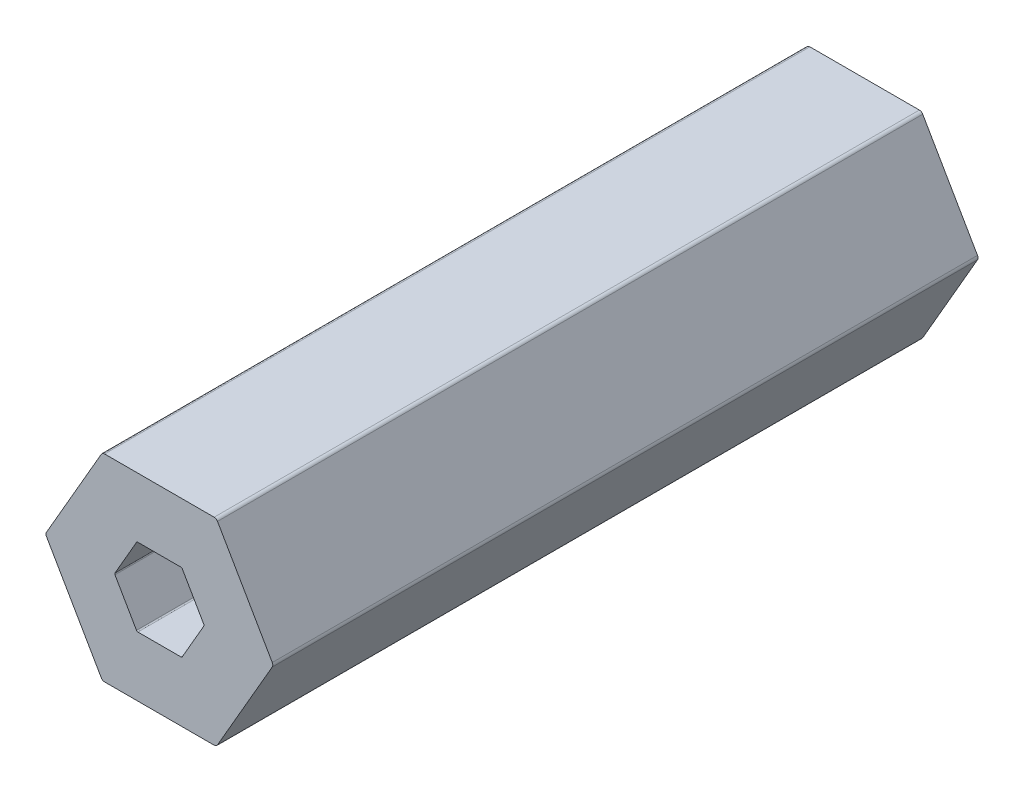
ISO-10303-21;
HEADER;
FILE_DESCRIPTION(('STEP AP214'),'2;1');
FILE_NAME('part.step','',(''),(''),'','','');
FILE_SCHEMA(('AUTOMOTIVE_DESIGN { 1 0 10303 214 1 1 1 1 }'));
ENDSEC;
DATA;
#1=APPLICATION_CONTEXT('core data for automotive mechanical design processes');
#2=APPLICATION_PROTOCOL_DEFINITION('international standard','automotive_design',2000,#1);
#3=PRODUCT_CONTEXT('',#1,'mechanical');
#4=PRODUCT('Part','Part','',(#3));
#5=PRODUCT_RELATED_PRODUCT_CATEGORY('part','',(#4));
#6=PRODUCT_DEFINITION_FORMATION('','',#4);
#7=PRODUCT_DEFINITION_CONTEXT('part definition',#1,'design');
#8=PRODUCT_DEFINITION('design','',#6,#7);
#9=PRODUCT_DEFINITION_SHAPE('','',#8);
#10=(LENGTH_UNIT() NAMED_UNIT(*) SI_UNIT(.MILLI.,.METRE.));
#11=(NAMED_UNIT(*) PLANE_ANGLE_UNIT() SI_UNIT($,.RADIAN.));
#12=(NAMED_UNIT(*) SI_UNIT($,.STERADIAN.) SOLID_ANGLE_UNIT());
#13=UNCERTAINTY_MEASURE_WITH_UNIT(LENGTH_MEASURE(1.E-05),#10,'distance_accuracy_value','');
#14=(GEOMETRIC_REPRESENTATION_CONTEXT(3) GLOBAL_UNCERTAINTY_ASSIGNED_CONTEXT((#13)) GLOBAL_UNIT_ASSIGNED_CONTEXT((#10,
#11,#12)) REPRESENTATION_CONTEXT('',''));
#15=CARTESIAN_POINT('',(0.,0.,0.));
#16=DIRECTION('',(0.,0.,1.));
#17=DIRECTION('',(1.,0.,0.));
#18=AXIS2_PLACEMENT_3D('',#15,#16,#17);
#19=CARTESIAN_POINT('',(2.77128129211021,0.,400.));
#20=DIRECTION('',(0.,0.,1.));
#21=DIRECTION('',(1.,0.,0.));
#22=AXIS2_PLACEMENT_3D('',#19,#20,#21);
#23=CYLINDRICAL_SURFACE('',#22,0.1);
#24=CARTESIAN_POINT('',(2.77128129211021,0.,12.192));
#25=DIRECTION('',(0.,0.,-1.));
#26=DIRECTION('',(-1.,0.,0.));
#27=AXIS2_PLACEMENT_3D('',#24,#25,#26);
#28=CIRCLE('',#27,0.1);
#29=CARTESIAN_POINT('',(2.8712812921102,0.,12.192));
#30=VERTEX_POINT('',#29);
#31=CARTESIAN_POINT('',(2.85788383248864,0.0500000000000084,12.192));
#32=VERTEX_POINT('',#31);
#33=EDGE_CURVE('E451',#30,#32,#28,.F.);
#34=ORIENTED_EDGE('',*,*,#33,.F.);
#35=DIRECTION('',(0.,0.,1.));
#36=VECTOR('',#35,1.);
#37=CARTESIAN_POINT('',(2.8712812921102,0.,400.));
#38=LINE('',#37,#36);
#39=CARTESIAN_POINT('',(2.8712812921102,0.,57.554));
#40=VERTEX_POINT('',#39);
#41=EDGE_CURVE('E267',#30,#40,#38,.T.);
#42=ORIENTED_EDGE('',*,*,#41,.T.);
#43=CARTESIAN_POINT('',(2.77128129211021,0.,57.554));
#44=DIRECTION('',(0.,0.,1.));
#45=DIRECTION('',(1.,0.,0.));
#46=AXIS2_PLACEMENT_3D('',#43,#44,#45);
#47=CIRCLE('',#46,0.1);
#48=CARTESIAN_POINT('',(2.85788383248864,0.0500000000000084,57.554));
#49=VERTEX_POINT('',#48);
#50=EDGE_CURVE('E430',#49,#40,#47,.F.);
#51=ORIENTED_EDGE('',*,*,#50,.F.);
#52=DIRECTION('',(0.,0.,1.));
#53=VECTOR('',#52,1.);
#54=CARTESIAN_POINT('',(2.85788383248865,0.0500000000000085,400.));
#55=LINE('',#54,#53);
#56=EDGE_CURVE('E295',#32,#49,#55,.T.);
#57=ORIENTED_EDGE('',*,*,#56,.F.);
#58=EDGE_LOOP('',(#34,#42,#51,#57));
#59=FACE_BOUND('',#58,.T.);
#60=ADVANCED_FACE('F68',(#59),#23,.F.);
#61=CARTESIAN_POINT('',(-7.04367328411341,0.,400.));
#62=DIRECTION('',(0.,0.,-1.));
#63=DIRECTION('',(-1.,0.,0.));
#64=AXIS2_PLACEMENT_3D('',#61,#62,#63);
#65=CYLINDRICAL_SURFACE('',#64,0.25);
#66=DIRECTION('',(0.,0.,-1.));
#67=VECTOR('',#66,1.);
#68=CARTESIAN_POINT('',(-7.29367328411341,0.,400.));
#69=LINE('',#68,#67);
#70=CARTESIAN_POINT('',(-7.29367328411341,0.,57.554));
#71=VERTEX_POINT('',#70);
#72=CARTESIAN_POINT('',(-7.29367328411341,0.,12.192));
#73=VERTEX_POINT('',#72);
#74=EDGE_CURVE('E269',#71,#73,#69,.T.);
#75=ORIENTED_EDGE('',*,*,#74,.T.);
#76=CARTESIAN_POINT('',(-7.04367328411341,0.,12.192));
#77=DIRECTION('',(0.,0.,-1.));
#78=DIRECTION('',(-1.,0.,0.));
#79=AXIS2_PLACEMENT_3D('',#76,#77,#78);
#80=CIRCLE('',#79,0.25);
#81=CARTESIAN_POINT('',(-7.26017963505952,-0.12500000000005,12.192));
#82=VERTEX_POINT('',#81);
#83=EDGE_CURVE('E407',#73,#82,#80,.F.);
#84=ORIENTED_EDGE('',*,*,#83,.T.);
#85=DIRECTION('',(0.,0.,-1.));
#86=VECTOR('',#85,1.);
#87=CARTESIAN_POINT('',(-7.26017963505952,-0.125000000000051,400.));
#88=LINE('',#87,#86);
#89=CARTESIAN_POINT('',(-7.26017963505952,-0.12500000000005,57.554));
#90=VERTEX_POINT('',#89);
#91=EDGE_CURVE('E282',#90,#82,#88,.T.);
#92=ORIENTED_EDGE('',*,*,#91,.F.);
#93=CARTESIAN_POINT('',(-7.04367328411341,0.,57.554));
#94=DIRECTION('',(0.,0.,1.));
#95=DIRECTION('',(1.,0.,0.));
#96=AXIS2_PLACEMENT_3D('',#93,#94,#95);
#97=CIRCLE('',#96,0.25);
#98=EDGE_CURVE('E389',#90,#71,#97,.F.);
#99=ORIENTED_EDGE('',*,*,#98,.T.);
#100=EDGE_LOOP('',(#75,#84,#92,#99));
#101=FACE_BOUND('',#100,.T.);
#102=ADVANCED_FACE('F405',(#101),#65,.T.);
#103=CARTESIAN_POINT('',(3.66617420935418,-6.34999999999993,400.));
#104=DIRECTION('',(-0.866025403784442,0.5,0.));
#105=DIRECTION('',(0.,0.,1.));
#106=AXIS2_PLACEMENT_3D('',#103,#104,#105);
#107=PLANE('',#106);
#108=DIRECTION('',(-0.499999999999999,-0.866025403784439,0.));
#109=VECTOR('',#108,1.);
#110=CARTESIAN_POINT('',(3.66617420935418,-6.34999999999993,12.192));
#111=LINE('',#110,#109);
#112=CARTESIAN_POINT('',(7.26017963505952,-0.125,12.192));
#113=VERTEX_POINT('',#112);
#114=CARTESIAN_POINT('',(3.73834299300289,-6.22499999999993,12.192));
#115=VERTEX_POINT('',#114);
#116=EDGE_CURVE('E471',#113,#115,#111,.T.);
#117=ORIENTED_EDGE('',*,*,#116,.F.);
#118=DIRECTION('',(0.,0.,1.));
#119=VECTOR('',#118,1.);
#120=CARTESIAN_POINT('',(7.26017963505952,-0.125,400.));
#121=LINE('',#120,#119);
#122=CARTESIAN_POINT('',(7.26017963505952,-0.125,57.554));
#123=VERTEX_POINT('',#122);
#124=EDGE_CURVE('E300',#113,#123,#121,.T.);
#125=ORIENTED_EDGE('',*,*,#124,.T.);
#126=DIRECTION('',(0.499999999999999,0.866025403784439,0.));
#127=VECTOR('',#126,1.);
#128=CARTESIAN_POINT('',(3.66617420935418,-6.34999999999993,57.554));
#129=LINE('',#128,#127);
#130=CARTESIAN_POINT('',(3.73834299300289,-6.22499999999993,57.554));
#131=VERTEX_POINT('',#130);
#132=EDGE_CURVE('E377',#131,#123,#129,.T.);
#133=ORIENTED_EDGE('',*,*,#132,.F.);
#134=DIRECTION('',(0.,0.,-1.));
#135=VECTOR('',#134,1.);
#136=CARTESIAN_POINT('',(3.73834299300288,-6.22499999999993,400.));
#137=LINE('',#136,#135);
#138=EDGE_CURVE('E297',#131,#115,#137,.T.);
#139=ORIENTED_EDGE('',*,*,#138,.T.);
#140=EDGE_LOOP('',(#117,#125,#133,#139));
#141=FACE_BOUND('',#140,.T.);
#142=ADVANCED_FACE('F483',(#141),#107,.F.);
#143=CARTESIAN_POINT('',(7.33234841870822,0.,400.));
#144=DIRECTION('',(-0.866025403784438,-0.5,0.));
#145=DIRECTION('',(-0.5,0.866025403784438,0.));
#146=AXIS2_PLACEMENT_3D('',#143,#144,#145);
#147=PLANE('',#146);
#148=DIRECTION('',(0.5,-0.866025403784438,0.));
#149=VECTOR('',#148,1.);
#150=CARTESIAN_POINT('',(7.33234841870822,0.,12.192));
#151=LINE('',#150,#149);
#152=CARTESIAN_POINT('',(3.7383429930028,6.225,12.192));
#153=VERTEX_POINT('',#152);
#154=CARTESIAN_POINT('',(7.26017963505952,0.125,12.192));
#155=VERTEX_POINT('',#154);
#156=EDGE_CURVE('E461',#153,#155,#151,.T.);
#157=ORIENTED_EDGE('',*,*,#156,.F.);
#158=DIRECTION('',(0.,0.,1.));
#159=VECTOR('',#158,1.);
#160=CARTESIAN_POINT('',(3.7383429930028,6.225,400.));
#161=LINE('',#160,#159);
#162=CARTESIAN_POINT('',(3.7383429930028,6.225,57.554));
#163=VERTEX_POINT('',#162);
#164=EDGE_CURVE('E288',#153,#163,#161,.T.);
#165=ORIENTED_EDGE('',*,*,#164,.T.);
#166=DIRECTION('',(-0.5,0.866025403784438,0.));
#167=VECTOR('',#166,1.);
#168=CARTESIAN_POINT('',(7.33234841870822,0.,57.554));
#169=LINE('',#168,#167);
#170=CARTESIAN_POINT('',(7.26017963505952,0.125,57.554));
#171=VERTEX_POINT('',#170);
#172=EDGE_CURVE('E365',#171,#163,#169,.T.);
#173=ORIENTED_EDGE('',*,*,#172,.F.);
#174=DIRECTION('',(0.,0.,-1.));
#175=VECTOR('',#174,1.);
#176=CARTESIAN_POINT('',(7.26017963505952,0.125,400.));
#177=LINE('',#176,#175);
#178=EDGE_CURVE('E290',#171,#155,#177,.T.);
#179=ORIENTED_EDGE('',*,*,#178,.T.);
#180=EDGE_LOOP('',(#157,#165,#173,#179));
#181=FACE_BOUND('',#180,.T.);
#182=ADVANCED_FACE('F491',(#181),#147,.F.);
#183=CARTESIAN_POINT('',(3.6661742093541,6.35,400.));
#184=DIRECTION('',(0.,-1.,0.));
#185=DIRECTION('',(0.,0.,-1.));
#186=AXIS2_PLACEMENT_3D('',#183,#184,#185);
#187=PLANE('',#186);
#188=DIRECTION('',(1.,0.,0.));
#189=VECTOR('',#188,1.);
#190=CARTESIAN_POINT('',(3.6661742093541,6.35,12.192));
#191=LINE('',#190,#189);
#192=CARTESIAN_POINT('',(-3.52183664205674,6.34999999999997,12.192));
#193=VERTEX_POINT('',#192);
#194=CARTESIAN_POINT('',(3.52183664205669,6.35,12.192));
#195=VERTEX_POINT('',#194);
#196=EDGE_CURVE('E83',#193,#195,#191,.T.);
#197=ORIENTED_EDGE('',*,*,#196,.F.);
#198=DIRECTION('',(0.,0.,1.));
#199=VECTOR('',#198,1.);
#200=CARTESIAN_POINT('',(-3.52183664205673,6.35,400.));
#201=LINE('',#200,#199);
#202=CARTESIAN_POINT('',(-3.52183664205674,6.34999999999997,57.554));
#203=VERTEX_POINT('',#202);
#204=EDGE_CURVE('E281',#193,#203,#201,.T.);
#205=ORIENTED_EDGE('',*,*,#204,.T.);
#206=DIRECTION('',(-1.,0.,0.));
#207=VECTOR('',#206,1.);
#208=CARTESIAN_POINT('',(3.6661742093541,6.35,57.554));
#209=LINE('',#208,#207);
#210=CARTESIAN_POINT('',(3.52183664205669,6.35,57.554));
#211=VERTEX_POINT('',#210);
#212=EDGE_CURVE('E359',#211,#203,#209,.T.);
#213=ORIENTED_EDGE('',*,*,#212,.F.);
#214=DIRECTION('',(0.,0.,-1.));
#215=VECTOR('',#214,1.);
#216=CARTESIAN_POINT('',(3.52183664205669,6.35,400.));
#217=LINE('',#216,#215);
#218=EDGE_CURVE('E271',#211,#195,#217,.T.);
#219=ORIENTED_EDGE('',*,*,#218,.T.);
#220=EDGE_LOOP('',(#197,#205,#213,#219));
#221=FACE_BOUND('',#220,.T.);
#222=ADVANCED_FACE('F498',(#221),#187,.F.);
#223=CARTESIAN_POINT('',(-3.66617420935414,6.35,400.));
#224=DIRECTION('',(0.866025403784442,-0.5,0.));
#225=DIRECTION('',(0.,0.,-1.));
#226=AXIS2_PLACEMENT_3D('',#223,#224,#225);
#227=PLANE('',#226);
#228=DIRECTION('',(0.499999999999999,0.866025403784439,0.));
#229=VECTOR('',#228,1.);
#230=CARTESIAN_POINT('',(-3.66617420935414,6.35,12.192));
#231=LINE('',#230,#229);
#232=CARTESIAN_POINT('',(-7.26017963505957,0.124999999999951,12.192));
#233=VERTEX_POINT('',#232);
#234=CARTESIAN_POINT('',(-3.73834299300284,6.225,12.192));
#235=VERTEX_POINT('',#234);
#236=EDGE_CURVE('E469',#233,#235,#231,.T.);
#237=ORIENTED_EDGE('',*,*,#236,.F.);
#238=DIRECTION('',(0.,0.,1.));
#239=VECTOR('',#238,1.);
#240=CARTESIAN_POINT('',(-7.26017963505952,0.124999999999949,400.));
#241=LINE('',#240,#239);
#242=CARTESIAN_POINT('',(-7.26017963505957,0.124999999999951,57.554));
#243=VERTEX_POINT('',#242);
#244=EDGE_CURVE('E270',#233,#243,#241,.T.);
#245=ORIENTED_EDGE('',*,*,#244,.T.);
#246=DIRECTION('',(-0.499999999999999,-0.866025403784439,0.));
#247=VECTOR('',#246,1.);
#248=CARTESIAN_POINT('',(-3.66617420935414,6.35,57.554));
#249=LINE('',#248,#247);
#250=CARTESIAN_POINT('',(-3.73834299300284,6.225,57.554));
#251=VERTEX_POINT('',#250);
#252=EDGE_CURVE('E374',#251,#243,#249,.T.);
#253=ORIENTED_EDGE('',*,*,#252,.F.);
#254=DIRECTION('',(0.,0.,-1.));
#255=VECTOR('',#254,1.);
#256=CARTESIAN_POINT('',(-3.73834299300284,6.225,400.));
#257=LINE('',#256,#255);
#258=EDGE_CURVE('E272',#251,#235,#257,.T.);
#259=ORIENTED_EDGE('',*,*,#258,.T.);
#260=EDGE_LOOP('',(#237,#245,#253,#259));
#261=FACE_BOUND('',#260,.T.);
#262=ADVANCED_FACE('F505',(#261),#227,.F.);
#263=CARTESIAN_POINT('',(-7.33234841870822,0.,400.));
#264=DIRECTION('',(0.866025403784435,0.500000000000007,0.));
#265=DIRECTION('',(0.,0.,-1.));
#266=AXIS2_PLACEMENT_3D('',#263,#264,#265);
#267=PLANE('',#266);
#268=DIRECTION('',(-0.500000000000007,0.866025403784435,0.));
#269=VECTOR('',#268,1.);
#270=CARTESIAN_POINT('',(-7.33234841870822,0.,12.192));
#271=LINE('',#270,#269);
#272=CARTESIAN_POINT('',(-3.73834299300275,-6.225,12.192));
#273=VERTEX_POINT('',#272);
#274=EDGE_CURVE('E413',#273,#82,#271,.T.);
#275=ORIENTED_EDGE('',*,*,#274,.F.);
#276=DIRECTION('',(0.,0.,1.));
#277=VECTOR('',#276,1.);
#278=CARTESIAN_POINT('',(-3.73834299300275,-6.225,400.));
#279=LINE('',#278,#277);
#280=CARTESIAN_POINT('',(-3.73834299300275,-6.225,57.554));
#281=VERTEX_POINT('',#280);
#282=EDGE_CURVE('E265',#273,#281,#279,.T.);
#283=ORIENTED_EDGE('',*,*,#282,.T.);
#284=DIRECTION('',(0.500000000000007,-0.866025403784435,0.));
#285=VECTOR('',#284,1.);
#286=CARTESIAN_POINT('',(-7.33234841870822,0.,57.554));
#287=LINE('',#286,#285);
#288=EDGE_CURVE('E317',#90,#281,#287,.T.);
#289=ORIENTED_EDGE('',*,*,#288,.F.);
#290=ORIENTED_EDGE('',*,*,#91,.T.);
#291=EDGE_LOOP('',(#275,#283,#289,#290));
#292=FACE_BOUND('',#291,.T.);
#293=ADVANCED_FACE('F402',(#292),#267,.F.);
#294=CARTESIAN_POINT('',(-3.66617420935405,-6.35,400.));
#295=DIRECTION('',(0.,1.,0.));
#296=DIRECTION('',(1.,0.,0.));
#297=AXIS2_PLACEMENT_3D('',#294,#295,#296);
#298=PLANE('',#297);
#299=DIRECTION('',(-1.,0.,0.));
#300=VECTOR('',#299,1.);
#301=CARTESIAN_POINT('',(-3.66617420935405,-6.35,12.192));
#302=LINE('',#301,#300);
#303=CARTESIAN_POINT('',(3.52183664205678,-6.35,12.192));
#304=VERTEX_POINT('',#303);
#305=CARTESIAN_POINT('',(-3.52183664205664,-6.35,12.192));
#306=VERTEX_POINT('',#305);
#307=EDGE_CURVE('E410',#304,#306,#302,.T.);
#308=ORIENTED_EDGE('',*,*,#307,.F.);
#309=DIRECTION('',(0.,0.,1.));
#310=VECTOR('',#309,1.);
#311=CARTESIAN_POINT('',(3.52183664205678,-6.35,400.));
#312=LINE('',#311,#310);
#313=CARTESIAN_POINT('',(3.52183664205678,-6.35,57.554));
#314=VERTEX_POINT('',#313);
#315=EDGE_CURVE('E285',#304,#314,#312,.T.);
#316=ORIENTED_EDGE('',*,*,#315,.T.);
#317=DIRECTION('',(1.,0.,0.));
#318=VECTOR('',#317,1.);
#319=CARTESIAN_POINT('',(-3.66617420935405,-6.35,57.554));
#320=LINE('',#319,#318);
#321=CARTESIAN_POINT('',(-3.52183664205664,-6.35,57.554));
#322=VERTEX_POINT('',#321);
#323=EDGE_CURVE('E386',#322,#314,#320,.T.);
#324=ORIENTED_EDGE('',*,*,#323,.F.);
#325=DIRECTION('',(0.,0.,-1.));
#326=VECTOR('',#325,1.);
#327=CARTESIAN_POINT('',(-3.52183664205664,-6.35,400.));
#328=LINE('',#327,#326);
#329=EDGE_CURVE('E287',#322,#306,#328,.T.);
#330=ORIENTED_EDGE('',*,*,#329,.T.);
#331=EDGE_LOOP('',(#308,#316,#324,#330));
#332=FACE_BOUND('',#331,.T.);
#333=ADVANCED_FACE('F529',(#332),#298,.F.);
#334=CARTESIAN_POINT('',(1.66837567297407,2.110288568297,400.));
#335=DIRECTION('',(-0.866025403784437,-0.5,0.));
#336=DIRECTION('',(-0.5,0.866025403784437,0.));
#337=AXIS2_PLACEMENT_3D('',#334,#335,#336);
#338=PLANE('',#337);
#339=DIRECTION('',(0.,0.,-1.));
#340=VECTOR('',#339,1.);
#341=CARTESIAN_POINT('',(1.47224318643354,2.45,0.));
#342=LINE('',#341,#340);
#343=CARTESIAN_POINT('',(1.47224318643354,2.45,57.554));
#344=VERTEX_POINT('',#343);
#345=CARTESIAN_POINT('',(1.47224318643354,2.45,12.192));
#346=VERTEX_POINT('',#345);
#347=EDGE_CURVE('E292',#344,#346,#342,.T.);
#348=ORIENTED_EDGE('',*,*,#347,.T.);
#349=DIRECTION('',(0.500000000000001,-0.866025403784438,0.));
#350=VECTOR('',#349,1.);
#351=CARTESIAN_POINT('',(1.66837567297407,2.110288568297,12.192));
#352=LINE('',#351,#350);
#353=EDGE_CURVE('E562',#346,#32,#352,.T.);
#354=ORIENTED_EDGE('',*,*,#353,.T.);
#355=ORIENTED_EDGE('',*,*,#56,.T.);
#356=DIRECTION('',(-0.500000000000001,0.866025403784438,0.));
#357=VECTOR('',#356,1.);
#358=CARTESIAN_POINT('',(1.66837567297407,2.110288568297,57.554));
#359=LINE('',#358,#357);
#360=EDGE_CURVE('E427',#49,#344,#359,.T.);
#361=ORIENTED_EDGE('',*,*,#360,.T.);
#362=EDGE_LOOP('',(#348,#354,#355,#361));
#363=FACE_BOUND('',#362,.T.);
#364=ADVANCED_FACE('F526',(#363),#338,.T.);
#365=CARTESIAN_POINT('',(-0.993375672974064,2.5,400.));
#366=DIRECTION('',(0.,-1.,0.));
#367=DIRECTION('',(0.,0.,-1.));
#368=AXIS2_PLACEMENT_3D('',#365,#366,#367);
#369=PLANE('',#368);
#370=DIRECTION('',(0.,0.,-1.));
#371=VECTOR('',#370,1.);
#372=CARTESIAN_POINT('',(-1.38564064605511,2.5,0.));
#373=LINE('',#372,#371);
#374=CARTESIAN_POINT('',(-1.38564064605511,2.5,57.554));
#375=VERTEX_POINT('',#374);
#376=CARTESIAN_POINT('',(-1.38564064605511,2.5,12.192));
#377=VERTEX_POINT('',#376);
#378=EDGE_CURVE('E258',#375,#377,#373,.T.);
#379=ORIENTED_EDGE('',*,*,#378,.T.);
#380=DIRECTION('',(1.,0.,0.));
#381=VECTOR('',#380,1.);
#382=CARTESIAN_POINT('',(-0.993375672974064,2.5,12.192));
#383=LINE('',#382,#381);
#384=CARTESIAN_POINT('',(1.38564064605509,2.50000000000001,12.192));
#385=VERTEX_POINT('',#384);
#386=EDGE_CURVE('E90',#377,#385,#383,.T.);
#387=ORIENTED_EDGE('',*,*,#386,.T.);
#388=DIRECTION('',(0.,0.,1.));
#389=VECTOR('',#388,1.);
#390=CARTESIAN_POINT('',(1.38564064605509,2.5,400.));
#391=LINE('',#390,#389);
#392=CARTESIAN_POINT('',(1.38564064605509,2.50000000000001,57.554));
#393=VERTEX_POINT('',#392);
#394=EDGE_CURVE('E291',#385,#393,#391,.T.);
#395=ORIENTED_EDGE('',*,*,#394,.T.);
#396=DIRECTION('',(-1.,0.,0.));
#397=VECTOR('',#396,1.);
#398=CARTESIAN_POINT('',(-0.993375672974064,2.5,57.554));
#399=LINE('',#398,#397);
#400=EDGE_CURVE('E306',#393,#375,#399,.T.);
#401=ORIENTED_EDGE('',*,*,#400,.T.);
#402=EDGE_LOOP('',(#379,#387,#395,#401));
#403=FACE_BOUND('',#402,.T.);
#404=ADVANCED_FACE('F310',(#403),#369,.T.);
#405=CARTESIAN_POINT('',(-2.66175134594813,0.389711431702997,400.));
#406=DIRECTION('',(0.86602540378444,-0.5,0.));
#407=DIRECTION('',(0.,0.,-1.));
#408=AXIS2_PLACEMENT_3D('',#405,#406,#407);
#409=PLANE('',#408);
#410=DIRECTION('',(0.,0.,-1.));
#411=VECTOR('',#410,1.);
#412=CARTESIAN_POINT('',(-2.85788383248865,0.0499999999999911,0.));
#413=LINE('',#412,#411);
#414=CARTESIAN_POINT('',(-2.85788383248865,0.0499999999999911,57.554));
#415=VERTEX_POINT('',#414);
#416=CARTESIAN_POINT('',(-2.85788383248865,0.0499999999999911,12.192));
#417=VERTEX_POINT('',#416);
#418=EDGE_CURVE('E252',#415,#417,#413,.T.);
#419=ORIENTED_EDGE('',*,*,#418,.T.);
#420=DIRECTION('',(0.499999999999999,0.866025403784439,0.));
#421=VECTOR('',#420,1.);
#422=CARTESIAN_POINT('',(-2.66175134594813,0.389711431702997,12.192));
#423=LINE('',#422,#421);
#424=CARTESIAN_POINT('',(-1.47224318643355,2.45,12.192));
#425=VERTEX_POINT('',#424);
#426=EDGE_CURVE('E239',#417,#425,#423,.T.);
#427=ORIENTED_EDGE('',*,*,#426,.T.);
#428=DIRECTION('',(0.,0.,1.));
#429=VECTOR('',#428,1.);
#430=CARTESIAN_POINT('',(-1.47224318643355,2.45,400.));
#431=LINE('',#430,#429);
#432=CARTESIAN_POINT('',(-1.47224318643355,2.45,57.554));
#433=VERTEX_POINT('',#432);
#434=EDGE_CURVE('E249',#425,#433,#431,.T.);
#435=ORIENTED_EDGE('',*,*,#434,.T.);
#436=DIRECTION('',(-0.499999999999999,-0.866025403784439,0.));
#437=VECTOR('',#436,1.);
#438=CARTESIAN_POINT('',(-2.66175134594813,0.389711431702997,57.554));
#439=LINE('',#438,#437);
#440=EDGE_CURVE('E308',#433,#415,#439,.T.);
#441=ORIENTED_EDGE('',*,*,#440,.T.);
#442=EDGE_LOOP('',(#419,#427,#435,#441));
#443=FACE_BOUND('',#442,.T.);
#444=ADVANCED_FACE('F247',(#443),#409,.T.);
#445=CARTESIAN_POINT('',(-1.71837567297406,-2.02368602791856,400.));
#446=DIRECTION('',(0.866025403784437,0.5,0.));
#447=DIRECTION('',(0.,0.,-1.));
#448=AXIS2_PLACEMENT_3D('',#445,#446,#447);
#449=PLANE('',#448);
#450=DIRECTION('',(0.,0.,-1.));
#451=VECTOR('',#450,1.);
#452=CARTESIAN_POINT('',(-1.47224318643354,-2.45,0.));
#453=LINE('',#452,#451);
#454=CARTESIAN_POINT('',(-1.47224318643355,-2.45,57.554));
#455=VERTEX_POINT('',#454);
#456=CARTESIAN_POINT('',(-1.47224318643355,-2.45,12.192));
#457=VERTEX_POINT('',#456);
#458=EDGE_CURVE('E256',#455,#457,#453,.T.);
#459=ORIENTED_EDGE('',*,*,#458,.T.);
#460=DIRECTION('',(-0.500000000000001,0.866025403784438,0.));
#461=VECTOR('',#460,1.);
#462=CARTESIAN_POINT('',(-1.71837567297406,-2.02368602791856,12.192));
#463=LINE('',#462,#461);
#464=CARTESIAN_POINT('',(-2.85788383248865,-0.050000000000009,12.192));
#465=VERTEX_POINT('',#464);
#466=EDGE_CURVE('E761',#457,#465,#463,.T.);
#467=ORIENTED_EDGE('',*,*,#466,.T.);
#468=DIRECTION('',(0.,0.,1.));
#469=VECTOR('',#468,1.);
#470=CARTESIAN_POINT('',(-2.85788383248865,-0.0500000000000092,400.));
#471=LINE('',#470,#469);
#472=CARTESIAN_POINT('',(-2.85788383248865,-0.050000000000009,57.554));
#473=VERTEX_POINT('',#472);
#474=EDGE_CURVE('E261',#465,#473,#471,.T.);
#475=ORIENTED_EDGE('',*,*,#474,.T.);
#476=DIRECTION('',(0.500000000000001,-0.866025403784438,0.));
#477=VECTOR('',#476,1.);
#478=CARTESIAN_POINT('',(-1.71837567297406,-2.02368602791856,57.554));
#479=LINE('',#478,#477);
#480=EDGE_CURVE('E424',#473,#455,#479,.T.);
#481=ORIENTED_EDGE('',*,*,#480,.T.);
#482=EDGE_LOOP('',(#459,#467,#475,#481));
#483=FACE_BOUND('',#482,.T.);
#484=ADVANCED_FACE('F440',(#483),#449,.T.);
#485=CARTESIAN_POINT('',(0.893375672974065,-2.5,400.));
#486=DIRECTION('',(0.,1.,0.));
#487=DIRECTION('',(1.,0.,0.));
#488=AXIS2_PLACEMENT_3D('',#485,#486,#487);
#489=PLANE('',#488);
#490=DIRECTION('',(0.,0.,-1.));
#491=VECTOR('',#490,1.);
#492=CARTESIAN_POINT('',(1.3856406460551,-2.5,0.));
#493=LINE('',#492,#491);
#494=CARTESIAN_POINT('',(1.3856406460551,-2.5,57.554));
#495=VERTEX_POINT('',#494);
#496=CARTESIAN_POINT('',(1.3856406460551,-2.5,12.192));
#497=VERTEX_POINT('',#496);
#498=EDGE_CURVE('E274',#495,#497,#493,.T.);
#499=ORIENTED_EDGE('',*,*,#498,.T.);
#500=DIRECTION('',(-1.,0.,0.));
#501=VECTOR('',#500,1.);
#502=CARTESIAN_POINT('',(0.893375672974065,-2.5,12.192));
#503=LINE('',#502,#501);
#504=CARTESIAN_POINT('',(-1.3856406460551,-2.5,12.192));
#505=VERTEX_POINT('',#504);
#506=EDGE_CURVE('E449',#497,#505,#503,.T.);
#507=ORIENTED_EDGE('',*,*,#506,.T.);
#508=DIRECTION('',(0.,0.,1.));
#509=VECTOR('',#508,1.);
#510=CARTESIAN_POINT('',(-1.3856406460551,-2.5,400.));
#511=LINE('',#510,#509);
#512=CARTESIAN_POINT('',(-1.3856406460551,-2.5,57.554));
#513=VERTEX_POINT('',#512);
#514=EDGE_CURVE('E277',#505,#513,#511,.T.);
#515=ORIENTED_EDGE('',*,*,#514,.T.);
#516=DIRECTION('',(1.,0.,0.));
#517=VECTOR('',#516,1.);
#518=CARTESIAN_POINT('',(0.893375672974065,-2.5,57.554));
#519=LINE('',#518,#517);
#520=EDGE_CURVE('E351',#513,#495,#519,.T.);
#521=ORIENTED_EDGE('',*,*,#520,.T.);
#522=EDGE_LOOP('',(#499,#507,#515,#521));
#523=FACE_BOUND('',#522,.T.);
#524=ADVANCED_FACE('F535',(#523),#489,.T.);
#525=CARTESIAN_POINT('',(1.66837567297407,-2.110288568297,400.));
#526=DIRECTION('',(-0.866025403784439,0.5,0.));
#527=DIRECTION('',(0.,0.,1.));
#528=AXIS2_PLACEMENT_3D('',#525,#526,#527);
#529=PLANE('',#528);
#530=DIRECTION('',(0.,0.,-1.));
#531=VECTOR('',#530,1.);
#532=CARTESIAN_POINT('',(2.85788383248865,-0.0499999999999919,0.));
#533=LINE('',#532,#531);
#534=CARTESIAN_POINT('',(2.85788383248865,-0.0499999999999915,57.554));
#535=VERTEX_POINT('',#534);
#536=CARTESIAN_POINT('',(2.85788383248865,-0.0499999999999915,12.192));
#537=VERTEX_POINT('',#536);
#538=EDGE_CURVE('E320',#535,#537,#533,.T.);
#539=ORIENTED_EDGE('',*,*,#538,.T.);
#540=DIRECTION('',(-0.5,-0.866025403784439,0.));
#541=VECTOR('',#540,1.);
#542=CARTESIAN_POINT('',(1.66837567297407,-2.110288568297,12.192));
#543=LINE('',#542,#541);
#544=CARTESIAN_POINT('',(1.47224318643354,-2.45,12.192));
#545=VERTEX_POINT('',#544);
#546=EDGE_CURVE('E341',#537,#545,#543,.T.);
#547=ORIENTED_EDGE('',*,*,#546,.T.);
#548=DIRECTION('',(0.,0.,1.));
#549=VECTOR('',#548,1.);
#550=CARTESIAN_POINT('',(1.47224318643355,-2.45,400.));
#551=LINE('',#550,#549);
#552=CARTESIAN_POINT('',(1.47224318643354,-2.45,57.554));
#553=VERTEX_POINT('',#552);
#554=EDGE_CURVE('E278',#545,#553,#551,.T.);
#555=ORIENTED_EDGE('',*,*,#554,.T.);
#556=DIRECTION('',(0.5,0.866025403784439,0.));
#557=VECTOR('',#556,1.);
#558=CARTESIAN_POINT('',(1.66837567297407,-2.110288568297,57.554));
#559=LINE('',#558,#557);
#560=EDGE_CURVE('E339',#553,#535,#559,.T.);
#561=ORIENTED_EDGE('',*,*,#560,.T.);
#562=EDGE_LOOP('',(#539,#547,#555,#561));
#563=FACE_BOUND('',#562,.T.);
#564=ADVANCED_FACE('F338',(#563),#529,.T.);
#565=CARTESIAN_POINT('',(3.52183664205677,-6.1,400.));
#566=DIRECTION('',(0.,0.,-1.));
#567=DIRECTION('',(-1.,0.,0.));
#568=AXIS2_PLACEMENT_3D('',#565,#566,#567);
#569=CYLINDRICAL_SURFACE('',#568,0.25);
#570=ORIENTED_EDGE('',*,*,#315,.F.);
#571=CARTESIAN_POINT('',(3.52183664205677,-6.1,12.192));
#572=DIRECTION('',(0.,0.,-1.));
#573=DIRECTION('',(-1.,0.,0.));
#574=AXIS2_PLACEMENT_3D('',#571,#572,#573);
#575=CIRCLE('',#574,0.25);
#576=EDGE_CURVE('E415',#304,#115,#575,.F.);
#577=ORIENTED_EDGE('',*,*,#576,.T.);
#578=ORIENTED_EDGE('',*,*,#138,.F.);
#579=CARTESIAN_POINT('',(3.52183664205677,-6.1,57.554));
#580=DIRECTION('',(0.,0.,1.));
#581=DIRECTION('',(1.,0.,0.));
#582=AXIS2_PLACEMENT_3D('',#579,#580,#581);
#583=CIRCLE('',#582,0.25);
#584=EDGE_CURVE('E383',#131,#314,#583,.F.);
#585=ORIENTED_EDGE('',*,*,#584,.T.);
#586=EDGE_LOOP('',(#570,#577,#578,#585));
#587=FACE_BOUND('',#586,.T.);
#588=ADVANCED_FACE('F478',(#587),#569,.T.);
#589=CARTESIAN_POINT('',(-3.52183664205664,-6.1,400.));
#590=DIRECTION('',(0.,0.,-1.));
#591=DIRECTION('',(-1.,0.,0.));
#592=AXIS2_PLACEMENT_3D('',#589,#590,#591);
#593=CYLINDRICAL_SURFACE('',#592,0.25);
#594=ORIENTED_EDGE('',*,*,#282,.F.);
#595=CARTESIAN_POINT('',(-3.52183664205664,-6.1,12.192));
#596=DIRECTION('',(0.,0.,-1.));
#597=DIRECTION('',(-1.,0.,0.));
#598=AXIS2_PLACEMENT_3D('',#595,#596,#597);
#599=CIRCLE('',#598,0.25);
#600=EDGE_CURVE('E409',#273,#306,#599,.F.);
#601=ORIENTED_EDGE('',*,*,#600,.T.);
#602=ORIENTED_EDGE('',*,*,#329,.F.);
#603=CARTESIAN_POINT('',(-3.52183664205664,-6.1,57.554));
#604=DIRECTION('',(0.,0.,1.));
#605=DIRECTION('',(1.,0.,0.));
#606=AXIS2_PLACEMENT_3D('',#603,#604,#605);
#607=CIRCLE('',#606,0.25);
#608=EDGE_CURVE('E391',#322,#281,#607,.F.);
#609=ORIENTED_EDGE('',*,*,#608,.T.);
#610=EDGE_LOOP('',(#594,#601,#602,#609));
#611=FACE_BOUND('',#610,.T.);
#612=ADVANCED_FACE('F531',(#611),#593,.T.);
#613=CARTESIAN_POINT('',(-7.04367328411341,0.,400.));
#614=DIRECTION('',(0.,0.,-1.));
#615=DIRECTION('',(-1.,0.,0.));
#616=AXIS2_PLACEMENT_3D('',#613,#614,#615);
#617=CYLINDRICAL_SURFACE('',#616,0.25);
#618=ORIENTED_EDGE('',*,*,#244,.F.);
#619=CARTESIAN_POINT('',(-7.04367328411341,0.,12.192));
#620=DIRECTION('',(0.,0.,-1.));
#621=DIRECTION('',(-1.,0.,0.));
#622=AXIS2_PLACEMENT_3D('',#619,#620,#621);
#623=CIRCLE('',#622,0.25);
#624=EDGE_CURVE('E473',#233,#73,#623,.F.);
#625=ORIENTED_EDGE('',*,*,#624,.T.);
#626=ORIENTED_EDGE('',*,*,#74,.F.);
#627=CARTESIAN_POINT('',(-7.04367328411341,0.,57.554));
#628=DIRECTION('',(0.,0.,1.));
#629=DIRECTION('',(1.,0.,0.));
#630=AXIS2_PLACEMENT_3D('',#627,#628,#629);
#631=CIRCLE('',#630,0.25);
#632=EDGE_CURVE('E380',#71,#243,#631,.F.);
#633=ORIENTED_EDGE('',*,*,#632,.T.);
#634=EDGE_LOOP('',(#618,#625,#626,#633));
#635=FACE_BOUND('',#634,.T.);
#636=ADVANCED_FACE('F508',(#635),#617,.T.);
#637=CARTESIAN_POINT('',(-3.52183664205673,6.1,400.));
#638=DIRECTION('',(0.,0.,-1.));
#639=DIRECTION('',(-1.,0.,0.));
#640=AXIS2_PLACEMENT_3D('',#637,#638,#639);
#641=CYLINDRICAL_SURFACE('',#640,0.25);
#642=ORIENTED_EDGE('',*,*,#204,.F.);
#643=CARTESIAN_POINT('',(-3.52183664205673,6.1,12.192));
#644=DIRECTION('',(0.,0.,-1.));
#645=DIRECTION('',(-1.,0.,0.));
#646=AXIS2_PLACEMENT_3D('',#643,#644,#645);
#647=CIRCLE('',#646,0.25);
#648=EDGE_CURVE('E466',#193,#235,#647,.F.);
#649=ORIENTED_EDGE('',*,*,#648,.T.);
#650=ORIENTED_EDGE('',*,*,#258,.F.);
#651=CARTESIAN_POINT('',(-3.52183664205673,6.1,57.554));
#652=DIRECTION('',(0.,0.,1.));
#653=DIRECTION('',(1.,0.,0.));
#654=AXIS2_PLACEMENT_3D('',#651,#652,#653);
#655=CIRCLE('',#654,0.25);
#656=EDGE_CURVE('E371',#251,#203,#655,.F.);
#657=ORIENTED_EDGE('',*,*,#656,.T.);
#658=EDGE_LOOP('',(#642,#649,#650,#657));
#659=FACE_BOUND('',#658,.T.);
#660=ADVANCED_FACE('F70',(#659),#641,.T.);
#661=CARTESIAN_POINT('',(7.04367328411341,0.,400.));
#662=DIRECTION('',(0.,0.,-1.));
#663=DIRECTION('',(-1.,0.,0.));
#664=AXIS2_PLACEMENT_3D('',#661,#662,#663);
#665=CYLINDRICAL_SURFACE('',#664,0.25);
#666=ORIENTED_EDGE('',*,*,#124,.F.);
#667=CARTESIAN_POINT('',(7.04367328411341,0.,12.192));
#668=DIRECTION('',(0.,0.,-1.));
#669=DIRECTION('',(-1.,0.,0.));
#670=AXIS2_PLACEMENT_3D('',#667,#668,#669);
#671=CIRCLE('',#670,0.25);
#672=EDGE_CURVE('E463',#113,#155,#671,.F.);
#673=ORIENTED_EDGE('',*,*,#672,.T.);
#674=ORIENTED_EDGE('',*,*,#178,.F.);
#675=CARTESIAN_POINT('',(7.04367328411341,0.,57.554));
#676=DIRECTION('',(0.,0.,1.));
#677=DIRECTION('',(1.,0.,0.));
#678=AXIS2_PLACEMENT_3D('',#675,#676,#677);
#679=CIRCLE('',#678,0.25);
#680=EDGE_CURVE('E368',#171,#123,#679,.F.);
#681=ORIENTED_EDGE('',*,*,#680,.T.);
#682=EDGE_LOOP('',(#666,#673,#674,#681));
#683=FACE_BOUND('',#682,.T.);
#684=ADVANCED_FACE('F488',(#683),#665,.T.);
#685=CARTESIAN_POINT('',(3.52183664205669,6.1,400.));
#686=DIRECTION('',(0.,0.,-1.));
#687=DIRECTION('',(-1.,0.,0.));
#688=AXIS2_PLACEMENT_3D('',#685,#686,#687);
#689=CYLINDRICAL_SURFACE('',#688,0.25);
#690=ORIENTED_EDGE('',*,*,#164,.F.);
#691=CARTESIAN_POINT('',(3.52183664205669,6.1,12.192));
#692=DIRECTION('',(0.,0.,-1.));
#693=DIRECTION('',(-1.,0.,0.));
#694=AXIS2_PLACEMENT_3D('',#691,#692,#693);
#695=CIRCLE('',#694,0.25);
#696=EDGE_CURVE('E458',#153,#195,#695,.F.);
#697=ORIENTED_EDGE('',*,*,#696,.T.);
#698=ORIENTED_EDGE('',*,*,#218,.F.);
#699=CARTESIAN_POINT('',(3.52183664205669,6.1,57.554));
#700=DIRECTION('',(0.,0.,1.));
#701=DIRECTION('',(1.,0.,0.));
#702=AXIS2_PLACEMENT_3D('',#699,#700,#701);
#703=CIRCLE('',#702,0.25);
#704=EDGE_CURVE('E356',#211,#163,#703,.F.);
#705=ORIENTED_EDGE('',*,*,#704,.T.);
#706=EDGE_LOOP('',(#690,#697,#698,#705));
#707=FACE_BOUND('',#706,.T.);
#708=ADVANCED_FACE('F496',(#707),#689,.T.);
#709=CARTESIAN_POINT('',(-1.3856406460551,-2.4,400.));
#710=DIRECTION('',(0.,0.,1.));
#711=DIRECTION('',(1.,0.,0.));
#712=AXIS2_PLACEMENT_3D('',#709,#710,#711);
#713=CYLINDRICAL_SURFACE('',#712,0.1);
#714=CARTESIAN_POINT('',(-1.3856406460551,-2.4,12.192));
#715=DIRECTION('',(0.,0.,-1.));
#716=DIRECTION('',(-1.,0.,0.));
#717=AXIS2_PLACEMENT_3D('',#714,#715,#716);
#718=CIRCLE('',#717,0.1);
#719=EDGE_CURVE('E445',#457,#505,#718,.F.);
#720=ORIENTED_EDGE('',*,*,#719,.F.);
#721=ORIENTED_EDGE('',*,*,#458,.F.);
#722=CARTESIAN_POINT('',(-1.3856406460551,-2.4,57.554));
#723=DIRECTION('',(0.,0.,1.));
#724=DIRECTION('',(1.,0.,0.));
#725=AXIS2_PLACEMENT_3D('',#722,#723,#724);
#726=CIRCLE('',#725,0.1);
#727=EDGE_CURVE('E352',#513,#455,#726,.F.);
#728=ORIENTED_EDGE('',*,*,#727,.F.);
#729=ORIENTED_EDGE('',*,*,#514,.F.);
#730=EDGE_LOOP('',(#720,#721,#728,#729));
#731=FACE_BOUND('',#730,.T.);
#732=ADVANCED_FACE('F444',(#731),#713,.F.);
#733=CARTESIAN_POINT('',(-2.77128129211021,0.,400.));
#734=DIRECTION('',(0.,0.,1.));
#735=DIRECTION('',(1.,0.,0.));
#736=AXIS2_PLACEMENT_3D('',#733,#734,#735);
#737=CYLINDRICAL_SURFACE('',#736,0.1);
#738=CARTESIAN_POINT('',(-2.77128129211021,0.,12.192));
#739=DIRECTION('',(0.,0.,-1.));
#740=DIRECTION('',(-1.,0.,0.));
#741=AXIS2_PLACEMENT_3D('',#738,#739,#740);
#742=CIRCLE('',#741,0.1);
#743=EDGE_CURVE('E559',#417,#465,#742,.F.);
#744=ORIENTED_EDGE('',*,*,#743,.F.);
#745=ORIENTED_EDGE('',*,*,#418,.F.);
#746=CARTESIAN_POINT('',(-2.77128129211021,0.,57.554));
#747=DIRECTION('',(0.,0.,1.));
#748=DIRECTION('',(1.,0.,0.));
#749=AXIS2_PLACEMENT_3D('',#746,#747,#748);
#750=CIRCLE('',#749,0.1);
#751=EDGE_CURVE('E422',#473,#415,#750,.F.);
#752=ORIENTED_EDGE('',*,*,#751,.F.);
#753=ORIENTED_EDGE('',*,*,#474,.F.);
#754=EDGE_LOOP('',(#744,#745,#752,#753));
#755=FACE_BOUND('',#754,.T.);
#756=ADVANCED_FACE('F546',(#755),#737,.F.);
#757=CARTESIAN_POINT('',(1.3856406460551,-2.4,400.));
#758=DIRECTION('',(0.,0.,1.));
#759=DIRECTION('',(1.,0.,0.));
#760=AXIS2_PLACEMENT_3D('',#757,#758,#759);
#761=CYLINDRICAL_SURFACE('',#760,0.1);
#762=CARTESIAN_POINT('',(1.3856406460551,-2.4,12.192));
#763=DIRECTION('',(0.,0.,-1.));
#764=DIRECTION('',(-1.,0.,0.));
#765=AXIS2_PLACEMENT_3D('',#762,#763,#764);
#766=CIRCLE('',#765,0.1);
#767=EDGE_CURVE('E456',#497,#545,#766,.F.);
#768=ORIENTED_EDGE('',*,*,#767,.F.);
#769=ORIENTED_EDGE('',*,*,#498,.F.);
#770=CARTESIAN_POINT('',(1.3856406460551,-2.4,57.554));
#771=DIRECTION('',(0.,0.,1.));
#772=DIRECTION('',(1.,0.,0.));
#773=AXIS2_PLACEMENT_3D('',#770,#771,#772);
#774=CIRCLE('',#773,0.1);
#775=EDGE_CURVE('E346',#553,#495,#774,.F.);
#776=ORIENTED_EDGE('',*,*,#775,.F.);
#777=ORIENTED_EDGE('',*,*,#554,.F.);
#778=EDGE_LOOP('',(#768,#769,#776,#777));
#779=FACE_BOUND('',#778,.T.);
#780=ADVANCED_FACE('F355',(#779),#761,.F.);
#781=CARTESIAN_POINT('',(2.77128129211021,0.,400.));
#782=DIRECTION('',(0.,0.,1.));
#783=DIRECTION('',(1.,0.,0.));
#784=AXIS2_PLACEMENT_3D('',#781,#782,#783);
#785=CYLINDRICAL_SURFACE('',#784,0.1);
#786=CARTESIAN_POINT('',(2.77128129211021,0.,12.192));
#787=DIRECTION('',(0.,0.,-1.));
#788=DIRECTION('',(-1.,0.,0.));
#789=AXIS2_PLACEMENT_3D('',#786,#787,#788);
#790=CIRCLE('',#789,0.1);
#791=EDGE_CURVE('E447',#537,#30,#790,.F.);
#792=ORIENTED_EDGE('',*,*,#791,.F.);
#793=ORIENTED_EDGE('',*,*,#538,.F.);
#794=CARTESIAN_POINT('',(2.77128129211021,0.,57.554));
#795=DIRECTION('',(0.,0.,1.));
#796=DIRECTION('',(1.,0.,0.));
#797=AXIS2_PLACEMENT_3D('',#794,#795,#796);
#798=CIRCLE('',#797,0.1);
#799=EDGE_CURVE('E350',#40,#535,#798,.F.);
#800=ORIENTED_EDGE('',*,*,#799,.F.);
#801=ORIENTED_EDGE('',*,*,#41,.F.);
#802=EDGE_LOOP('',(#792,#793,#800,#801));
#803=FACE_BOUND('',#802,.T.);
#804=ADVANCED_FACE('F539',(#803),#785,.F.);
#805=CARTESIAN_POINT('',(1.3856406460551,2.4,400.));
#806=DIRECTION('',(0.,0.,1.));
#807=DIRECTION('',(1.,0.,0.));
#808=AXIS2_PLACEMENT_3D('',#805,#806,#807);
#809=CYLINDRICAL_SURFACE('',#808,0.1);
#810=CARTESIAN_POINT('',(1.3856406460551,2.4,12.192));
#811=DIRECTION('',(0.,0.,-1.));
#812=DIRECTION('',(-1.,0.,0.));
#813=AXIS2_PLACEMENT_3D('',#810,#811,#812);
#814=CIRCLE('',#813,0.1);
#815=EDGE_CURVE('E558',#346,#385,#814,.F.);
#816=ORIENTED_EDGE('',*,*,#815,.F.);
#817=ORIENTED_EDGE('',*,*,#347,.F.);
#818=CARTESIAN_POINT('',(1.3856406460551,2.4,57.554));
#819=DIRECTION('',(0.,0.,1.));
#820=DIRECTION('',(1.,0.,0.));
#821=AXIS2_PLACEMENT_3D('',#818,#819,#820);
#822=CIRCLE('',#821,0.1);
#823=EDGE_CURVE('E312',#393,#344,#822,.F.);
#824=ORIENTED_EDGE('',*,*,#823,.F.);
#825=ORIENTED_EDGE('',*,*,#394,.F.);
#826=EDGE_LOOP('',(#816,#817,#824,#825));
#827=FACE_BOUND('',#826,.T.);
#828=ADVANCED_FACE('F542',(#827),#809,.F.);
#829=CARTESIAN_POINT('',(-1.38564064605511,2.4,400.));
#830=DIRECTION('',(0.,0.,1.));
#831=DIRECTION('',(1.,0.,0.));
#832=AXIS2_PLACEMENT_3D('',#829,#830,#831);
#833=CYLINDRICAL_SURFACE('',#832,0.1);
#834=CARTESIAN_POINT('',(-1.38564064605511,2.4,12.192));
#835=DIRECTION('',(0.,0.,-1.));
#836=DIRECTION('',(-1.,0.,0.));
#837=AXIS2_PLACEMENT_3D('',#834,#835,#836);
#838=CIRCLE('',#837,0.1);
#839=EDGE_CURVE('E12',#377,#425,#838,.F.);
#840=ORIENTED_EDGE('',*,*,#839,.F.);
#841=ORIENTED_EDGE('',*,*,#378,.F.);
#842=CARTESIAN_POINT('',(-1.38564064605511,2.4,57.554));
#843=DIRECTION('',(0.,0.,1.));
#844=DIRECTION('',(1.,0.,0.));
#845=AXIS2_PLACEMENT_3D('',#842,#843,#844);
#846=CIRCLE('',#845,0.1);
#847=EDGE_CURVE('E76',#433,#375,#846,.F.);
#848=ORIENTED_EDGE('',*,*,#847,.F.);
#849=ORIENTED_EDGE('',*,*,#434,.F.);
#850=EDGE_LOOP('',(#840,#841,#848,#849));
#851=FACE_BOUND('',#850,.T.);
#852=ADVANCED_FACE('F255',(#851),#833,.F.);
#853=CARTESIAN_POINT('',(0.,0.,57.554));
#854=DIRECTION('',(0.,0.,1.));
#855=DIRECTION('',(1.,0.,0.));
#856=AXIS2_PLACEMENT_3D('',#853,#854,#855);
#857=PLANE('',#856);
#858=ORIENTED_EDGE('',*,*,#775,.T.);
#859=ORIENTED_EDGE('',*,*,#520,.F.);
#860=ORIENTED_EDGE('',*,*,#727,.T.);
#861=ORIENTED_EDGE('',*,*,#480,.F.);
#862=ORIENTED_EDGE('',*,*,#751,.T.);
#863=ORIENTED_EDGE('',*,*,#440,.F.);
#864=ORIENTED_EDGE('',*,*,#847,.T.);
#865=ORIENTED_EDGE('',*,*,#400,.F.);
#866=ORIENTED_EDGE('',*,*,#823,.T.);
#867=ORIENTED_EDGE('',*,*,#360,.F.);
#868=ORIENTED_EDGE('',*,*,#50,.T.);
#869=ORIENTED_EDGE('',*,*,#799,.T.);
#870=ORIENTED_EDGE('',*,*,#560,.F.);
#871=EDGE_LOOP('',(#858,#859,#860,#861,#862,#863,#864,#865,#866,#867,#868,#869,#870));
#872=FACE_BOUND('',#871,.T.);
#873=ORIENTED_EDGE('',*,*,#288,.T.);
#874=ORIENTED_EDGE('',*,*,#608,.F.);
#875=ORIENTED_EDGE('',*,*,#323,.T.);
#876=ORIENTED_EDGE('',*,*,#584,.F.);
#877=ORIENTED_EDGE('',*,*,#132,.T.);
#878=ORIENTED_EDGE('',*,*,#680,.F.);
#879=ORIENTED_EDGE('',*,*,#172,.T.);
#880=ORIENTED_EDGE('',*,*,#704,.F.);
#881=ORIENTED_EDGE('',*,*,#212,.T.);
#882=ORIENTED_EDGE('',*,*,#656,.F.);
#883=ORIENTED_EDGE('',*,*,#252,.T.);
#884=ORIENTED_EDGE('',*,*,#632,.F.);
#885=ORIENTED_EDGE('',*,*,#98,.F.);
#886=EDGE_LOOP('',(#873,#874,#875,#876,#877,#878,#879,#880,#881,#882,#883,#884,#885));
#887=FACE_BOUND('',#886,.T.);
#888=ADVANCED_FACE('F304',(#872,#887),#857,.T.);
#889=CARTESIAN_POINT('',(0.,0.,12.192));
#890=DIRECTION('',(0.,0.,-1.));
#891=DIRECTION('',(-1.,0.,0.));
#892=AXIS2_PLACEMENT_3D('',#889,#890,#891);
#893=PLANE('',#892);
#894=ORIENTED_EDGE('',*,*,#767,.T.);
#895=ORIENTED_EDGE('',*,*,#546,.F.);
#896=ORIENTED_EDGE('',*,*,#791,.T.);
#897=ORIENTED_EDGE('',*,*,#33,.T.);
#898=ORIENTED_EDGE('',*,*,#353,.F.);
#899=ORIENTED_EDGE('',*,*,#815,.T.);
#900=ORIENTED_EDGE('',*,*,#386,.F.);
#901=ORIENTED_EDGE('',*,*,#839,.T.);
#902=ORIENTED_EDGE('',*,*,#426,.F.);
#903=ORIENTED_EDGE('',*,*,#743,.T.);
#904=ORIENTED_EDGE('',*,*,#466,.F.);
#905=ORIENTED_EDGE('',*,*,#719,.T.);
#906=ORIENTED_EDGE('',*,*,#506,.F.);
#907=EDGE_LOOP('',(#894,#895,#896,#897,#898,#899,#900,#901,#902,#903,#904,#905,#906));
#908=FACE_BOUND('',#907,.T.);
#909=ORIENTED_EDGE('',*,*,#274,.T.);
#910=ORIENTED_EDGE('',*,*,#83,.F.);
#911=ORIENTED_EDGE('',*,*,#624,.F.);
#912=ORIENTED_EDGE('',*,*,#236,.T.);
#913=ORIENTED_EDGE('',*,*,#648,.F.);
#914=ORIENTED_EDGE('',*,*,#196,.T.);
#915=ORIENTED_EDGE('',*,*,#696,.F.);
#916=ORIENTED_EDGE('',*,*,#156,.T.);
#917=ORIENTED_EDGE('',*,*,#672,.F.);
#918=ORIENTED_EDGE('',*,*,#116,.T.);
#919=ORIENTED_EDGE('',*,*,#576,.F.);
#920=ORIENTED_EDGE('',*,*,#307,.T.);
#921=ORIENTED_EDGE('',*,*,#600,.F.);
#922=EDGE_LOOP('',(#909,#910,#911,#912,#913,#914,#915,#916,#917,#918,#919,#920,#921));
#923=FACE_BOUND('',#922,.T.);
#924=ADVANCED_FACE('F238',(#908,#923),#893,.T.);
#925=CLOSED_SHELL('',(#60,#102,#142,#182,#222,#262,#293,#333,#364,#404,#444,#484,#524,#564,#588,
#612,#636,#660,#684,#708,#732,#756,#780,#804,#828,#852,#888,#924));
#926=MANIFOLD_SOLID_BREP('B2',#925);
#927=ADVANCED_BREP_SHAPE_REPRESENTATION('',(#18,#926),#14);
#928=SHAPE_DEFINITION_REPRESENTATION(#9,#927);
ENDSEC;
END-ISO-10303-21;
